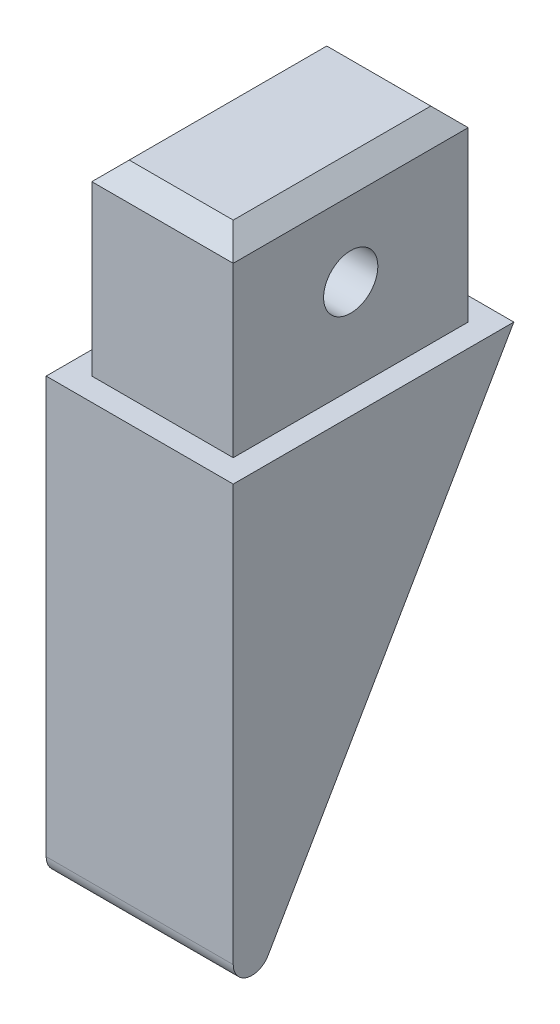
ISO-10303-21;
HEADER;
FILE_DESCRIPTION(('STEP AP214'),'2;1');
FILE_NAME('part.step','',(''),(''),'','','');
FILE_SCHEMA(('AUTOMOTIVE_DESIGN { 1 0 10303 214 1 1 1 1 }'));
ENDSEC;
DATA;
#1=APPLICATION_CONTEXT('core data for automotive mechanical design processes');
#2=APPLICATION_PROTOCOL_DEFINITION('international standard','automotive_design',2000,#1);
#3=PRODUCT_CONTEXT('',#1,'mechanical');
#4=PRODUCT('Part','Part','',(#3));
#5=PRODUCT_RELATED_PRODUCT_CATEGORY('part','',(#4));
#6=PRODUCT_DEFINITION_FORMATION('','',#4);
#7=PRODUCT_DEFINITION_CONTEXT('part definition',#1,'design');
#8=PRODUCT_DEFINITION('design','',#6,#7);
#9=PRODUCT_DEFINITION_SHAPE('','',#8);
#10=(LENGTH_UNIT() NAMED_UNIT(*) SI_UNIT(.MILLI.,.METRE.));
#11=(NAMED_UNIT(*) PLANE_ANGLE_UNIT() SI_UNIT($,.RADIAN.));
#12=(NAMED_UNIT(*) SI_UNIT($,.STERADIAN.) SOLID_ANGLE_UNIT());
#13=UNCERTAINTY_MEASURE_WITH_UNIT(LENGTH_MEASURE(1.E-05),#10,'distance_accuracy_value','');
#14=(GEOMETRIC_REPRESENTATION_CONTEXT(3) GLOBAL_UNCERTAINTY_ASSIGNED_CONTEXT((#13)) GLOBAL_UNIT_ASSIGNED_CONTEXT((#10,
#11,#12)) REPRESENTATION_CONTEXT('',''));
#15=CARTESIAN_POINT('',(0.,0.,0.));
#16=DIRECTION('',(0.,0.,1.));
#17=DIRECTION('',(1.,0.,0.));
#18=AXIS2_PLACEMENT_3D('',#15,#16,#17);
#19=CARTESIAN_POINT('',(-3.78,10.,6.28));
#20=DIRECTION('',(1.,0.,0.));
#21=DIRECTION('',(0.,0.,-1.));
#22=AXIS2_PLACEMENT_3D('',#19,#20,#21);
#23=PLANE('',#22);
#24=CARTESIAN_POINT('',(-3.78,5.,0.));
#25=DIRECTION('',(1.,0.,0.));
#26=DIRECTION('',(0.,0.,-1.));
#27=AXIS2_PLACEMENT_3D('',#24,#25,#26);
#28=CIRCLE('',#27,1.45000000000001);
#29=CARTESIAN_POINT('',(-3.78,5.,-1.45000000000001));
#30=VERTEX_POINT('',#29);
#31=EDGE_CURVE('E153',#30,#30,#28,.T.);
#32=ORIENTED_EDGE('',*,*,#31,.T.);
#33=EDGE_LOOP('',(#32));
#34=FACE_BOUND('',#33,.T.);
#35=DIRECTION('',(0.,-1.,0.));
#36=VECTOR('',#35,1.);
#37=CARTESIAN_POINT('',(-3.78,10.,6.28));
#38=LINE('',#37,#36);
#39=CARTESIAN_POINT('',(-3.78,9.,6.28));
#40=VERTEX_POINT('',#39);
#41=CARTESIAN_POINT('',(-3.78,0.,6.28));
#42=VERTEX_POINT('',#41);
#43=EDGE_CURVE('E193',#40,#42,#38,.T.);
#44=ORIENTED_EDGE('',*,*,#43,.F.);
#45=DIRECTION('',(0.,0.,-1.));
#46=VECTOR('',#45,1.);
#47=CARTESIAN_POINT('',(-3.78,9.,6.28));
#48=LINE('',#47,#46);
#49=CARTESIAN_POINT('',(-3.78,9.,-6.28));
#50=VERTEX_POINT('',#49);
#51=EDGE_CURVE('E220',#40,#50,#48,.T.);
#52=ORIENTED_EDGE('',*,*,#51,.T.);
#53=DIRECTION('',(0.,-1.,0.));
#54=VECTOR('',#53,1.);
#55=CARTESIAN_POINT('',(-3.78,10.,-6.28));
#56=LINE('',#55,#54);
#57=CARTESIAN_POINT('',(-3.78,0.,-6.28));
#58=VERTEX_POINT('',#57);
#59=EDGE_CURVE('E181',#50,#58,#56,.T.);
#60=ORIENTED_EDGE('',*,*,#59,.T.);
#61=DIRECTION('',(0.,0.,1.));
#62=VECTOR('',#61,1.);
#63=CARTESIAN_POINT('',(-3.78,0.,6.28));
#64=LINE('',#63,#62);
#65=EDGE_CURVE('E164',#58,#42,#64,.T.);
#66=ORIENTED_EDGE('',*,*,#65,.T.);
#67=EDGE_LOOP('',(#44,#52,#60,#66));
#68=FACE_BOUND('',#67,.T.);
#69=ADVANCED_FACE('F47',(#34,#68),#23,.F.);
#70=CARTESIAN_POINT('',(-3.78,10.,6.28));
#71=DIRECTION('',(0.,0.,-1.));
#72=DIRECTION('',(-1.,0.,0.));
#73=AXIS2_PLACEMENT_3D('',#70,#71,#72);
#74=PLANE('',#73);
#75=DIRECTION('',(0.,-1.,0.));
#76=VECTOR('',#75,1.);
#77=CARTESIAN_POINT('',(3.78,10.,6.28));
#78=LINE('',#77,#76);
#79=CARTESIAN_POINT('',(3.78,9.,6.28));
#80=VERTEX_POINT('',#79);
#81=CARTESIAN_POINT('',(3.78,0.,6.28));
#82=VERTEX_POINT('',#81);
#83=EDGE_CURVE('E189',#80,#82,#78,.T.);
#84=ORIENTED_EDGE('',*,*,#83,.F.);
#85=DIRECTION('',(-1.,0.,0.));
#86=VECTOR('',#85,1.);
#87=CARTESIAN_POINT('',(-3.78,9.,6.28));
#88=LINE('',#87,#86);
#89=EDGE_CURVE('E217',#80,#40,#88,.T.);
#90=ORIENTED_EDGE('',*,*,#89,.T.);
#91=ORIENTED_EDGE('',*,*,#43,.T.);
#92=DIRECTION('',(1.,0.,0.));
#93=VECTOR('',#92,1.);
#94=CARTESIAN_POINT('',(-3.78,0.,6.28));
#95=LINE('',#94,#93);
#96=EDGE_CURVE('E168',#42,#82,#95,.T.);
#97=ORIENTED_EDGE('',*,*,#96,.T.);
#98=EDGE_LOOP('',(#84,#90,#91,#97));
#99=FACE_BOUND('',#98,.T.);
#100=ADVANCED_FACE('F256',(#99),#74,.F.);
#101=CARTESIAN_POINT('',(3.78,10.,6.28));
#102=DIRECTION('',(-1.,0.,0.));
#103=DIRECTION('',(0.,0.,1.));
#104=AXIS2_PLACEMENT_3D('',#101,#102,#103);
#105=PLANE('',#104);
#106=CARTESIAN_POINT('',(3.78,5.,0.));
#107=DIRECTION('',(1.,0.,0.));
#108=DIRECTION('',(0.,0.,-1.));
#109=AXIS2_PLACEMENT_3D('',#106,#107,#108);
#110=CIRCLE('',#109,1.45000000000001);
#111=CARTESIAN_POINT('',(3.78,5.,-1.45000000000001));
#112=VERTEX_POINT('',#111);
#113=EDGE_CURVE('E335',#112,#112,#110,.T.);
#114=ORIENTED_EDGE('',*,*,#113,.F.);
#115=EDGE_LOOP('',(#114));
#116=FACE_BOUND('',#115,.T.);
#117=DIRECTION('',(0.,-1.,0.));
#118=VECTOR('',#117,1.);
#119=CARTESIAN_POINT('',(3.78,10.,-6.28));
#120=LINE('',#119,#118);
#121=CARTESIAN_POINT('',(3.78,9.,-6.28));
#122=VERTEX_POINT('',#121);
#123=CARTESIAN_POINT('',(3.78,0.,-6.28));
#124=VERTEX_POINT('',#123);
#125=EDGE_CURVE('E185',#122,#124,#120,.T.);
#126=ORIENTED_EDGE('',*,*,#125,.F.);
#127=DIRECTION('',(0.,0.,1.));
#128=VECTOR('',#127,1.);
#129=CARTESIAN_POINT('',(3.78,9.,6.28));
#130=LINE('',#129,#128);
#131=EDGE_CURVE('E214',#122,#80,#130,.T.);
#132=ORIENTED_EDGE('',*,*,#131,.T.);
#133=ORIENTED_EDGE('',*,*,#83,.T.);
#134=DIRECTION('',(0.,0.,-1.));
#135=VECTOR('',#134,1.);
#136=CARTESIAN_POINT('',(3.78,0.,6.28));
#137=LINE('',#136,#135);
#138=EDGE_CURVE('E173',#82,#124,#137,.T.);
#139=ORIENTED_EDGE('',*,*,#138,.T.);
#140=EDGE_LOOP('',(#126,#132,#133,#139));
#141=FACE_BOUND('',#140,.T.);
#142=ADVANCED_FACE('F264',(#116,#141),#105,.F.);
#143=CARTESIAN_POINT('',(-3.78,10.,-6.28));
#144=DIRECTION('',(0.,0.,1.));
#145=DIRECTION('',(1.,0.,0.));
#146=AXIS2_PLACEMENT_3D('',#143,#144,#145);
#147=PLANE('',#146);
#148=ORIENTED_EDGE('',*,*,#59,.F.);
#149=DIRECTION('',(1.,0.,0.));
#150=VECTOR('',#149,1.);
#151=CARTESIAN_POINT('',(-3.78,9.,-6.28));
#152=LINE('',#151,#150);
#153=EDGE_CURVE('E210',#50,#122,#152,.T.);
#154=ORIENTED_EDGE('',*,*,#153,.T.);
#155=ORIENTED_EDGE('',*,*,#125,.T.);
#156=DIRECTION('',(-1.,0.,0.));
#157=VECTOR('',#156,1.);
#158=CARTESIAN_POINT('',(-3.78,0.,-6.28));
#159=LINE('',#158,#157);
#160=EDGE_CURVE('E177',#124,#58,#159,.T.);
#161=ORIENTED_EDGE('',*,*,#160,.T.);
#162=EDGE_LOOP('',(#148,#154,#155,#161));
#163=FACE_BOUND('',#162,.T.);
#164=ADVANCED_FACE('F301',(#163),#147,.F.);
#165=CARTESIAN_POINT('',(0.,10.,0.));
#166=DIRECTION('',(0.,-1.,0.));
#167=DIRECTION('',(0.,0.,-1.));
#168=AXIS2_PLACEMENT_3D('',#165,#166,#167);
#169=PLANE('',#168);
#170=DIRECTION('',(0.,0.,-1.));
#171=VECTOR('',#170,1.);
#172=CARTESIAN_POINT('',(2.78,10.,0.));
#173=LINE('',#172,#171);
#174=CARTESIAN_POINT('',(2.78,10.,5.28));
#175=VERTEX_POINT('',#174);
#176=CARTESIAN_POINT('',(2.78,10.,-5.28));
#177=VERTEX_POINT('',#176);
#178=EDGE_CURVE('E203',#175,#177,#173,.T.);
#179=ORIENTED_EDGE('',*,*,#178,.T.);
#180=DIRECTION('',(-1.,0.,0.));
#181=VECTOR('',#180,1.);
#182=CARTESIAN_POINT('',(0.,10.,-5.28));
#183=LINE('',#182,#181);
#184=CARTESIAN_POINT('',(-2.78,10.,-5.28));
#185=VERTEX_POINT('',#184);
#186=EDGE_CURVE('E206',#177,#185,#183,.T.);
#187=ORIENTED_EDGE('',*,*,#186,.T.);
#188=DIRECTION('',(0.,0.,1.));
#189=VECTOR('',#188,1.);
#190=CARTESIAN_POINT('',(-2.78,10.,0.));
#191=LINE('',#190,#189);
#192=CARTESIAN_POINT('',(-2.78,10.,5.28));
#193=VERTEX_POINT('',#192);
#194=EDGE_CURVE('E197',#185,#193,#191,.T.);
#195=ORIENTED_EDGE('',*,*,#194,.T.);
#196=DIRECTION('',(1.,0.,0.));
#197=VECTOR('',#196,1.);
#198=CARTESIAN_POINT('',(0.,10.,5.28));
#199=LINE('',#198,#197);
#200=EDGE_CURVE('E200',#193,#175,#199,.T.);
#201=ORIENTED_EDGE('',*,*,#200,.T.);
#202=EDGE_LOOP('',(#179,#187,#195,#201));
#203=FACE_BOUND('',#202,.T.);
#204=ADVANCED_FACE('F296',(#203),#169,.F.);
#205=CARTESIAN_POINT('',(0.,10.,5.28));
#206=DIRECTION('',(0.,-0.707106781186546,-0.707106781186549));
#207=DIRECTION('',(1.,0.,0.));
#208=AXIS2_PLACEMENT_3D('',#205,#206,#207);
#209=PLANE('',#208);
#210=DIRECTION('',(0.577350269189625,0.577350269189627,-0.577350269189625));
#211=VECTOR('',#210,1.);
#212=CARTESIAN_POINT('',(-1.02000000000001,11.76,3.52000000000001));
#213=LINE('',#212,#211);
#214=EDGE_CURVE('E229',#40,#193,#213,.T.);
#215=ORIENTED_EDGE('',*,*,#214,.F.);
#216=ORIENTED_EDGE('',*,*,#89,.F.);
#217=DIRECTION('',(-0.577350269189625,0.577350269189627,-0.577350269189625));
#218=VECTOR('',#217,1.);
#219=CARTESIAN_POINT('',(1.85333333333334,10.9266666666667,4.35333333333334));
#220=LINE('',#219,#218);
#221=EDGE_CURVE('E169',#175,#80,#220,.F.);
#222=ORIENTED_EDGE('',*,*,#221,.F.);
#223=ORIENTED_EDGE('',*,*,#200,.F.);
#224=EDGE_LOOP('',(#215,#216,#222,#223));
#225=FACE_BOUND('',#224,.T.);
#226=ADVANCED_FACE('F291',(#225),#209,.F.);
#227=CARTESIAN_POINT('',(2.78,10.,0.));
#228=DIRECTION('',(-0.707106781186549,-0.707106781186546,0.));
#229=DIRECTION('',(0.,0.,-1.));
#230=AXIS2_PLACEMENT_3D('',#227,#228,#229);
#231=PLANE('',#230);
#232=ORIENTED_EDGE('',*,*,#221,.T.);
#233=ORIENTED_EDGE('',*,*,#131,.F.);
#234=DIRECTION('',(-0.577350269189625,0.577350269189627,0.577350269189625));
#235=VECTOR('',#234,1.);
#236=CARTESIAN_POINT('',(1.02000000000001,11.76,-3.52));
#237=LINE('',#236,#235);
#238=EDGE_CURVE('E226',#177,#122,#237,.F.);
#239=ORIENTED_EDGE('',*,*,#238,.F.);
#240=ORIENTED_EDGE('',*,*,#178,.F.);
#241=EDGE_LOOP('',(#232,#233,#239,#240));
#242=FACE_BOUND('',#241,.T.);
#243=ADVANCED_FACE('F285',(#242),#231,.F.);
#244=CARTESIAN_POINT('',(-2.78,10.,0.));
#245=DIRECTION('',(0.707106781186549,-0.707106781186546,0.));
#246=DIRECTION('',(0.,0.,1.));
#247=AXIS2_PLACEMENT_3D('',#244,#245,#246);
#248=PLANE('',#247);
#249=ORIENTED_EDGE('',*,*,#214,.T.);
#250=ORIENTED_EDGE('',*,*,#194,.F.);
#251=DIRECTION('',(-0.577350269189625,-0.577350269189627,-0.577350269189625));
#252=VECTOR('',#251,1.);
#253=CARTESIAN_POINT('',(-1.02000000000001,11.76,-3.52));
#254=LINE('',#253,#252);
#255=EDGE_CURVE('E141',#50,#185,#254,.F.);
#256=ORIENTED_EDGE('',*,*,#255,.F.);
#257=ORIENTED_EDGE('',*,*,#51,.F.);
#258=EDGE_LOOP('',(#249,#250,#256,#257));
#259=FACE_BOUND('',#258,.T.);
#260=ADVANCED_FACE('F278',(#259),#248,.F.);
#261=CARTESIAN_POINT('',(0.,10.,-5.28));
#262=DIRECTION('',(0.,-0.707106781186546,0.707106781186549));
#263=DIRECTION('',(-1.,0.,0.));
#264=AXIS2_PLACEMENT_3D('',#261,#262,#263);
#265=PLANE('',#264);
#266=ORIENTED_EDGE('',*,*,#238,.T.);
#267=ORIENTED_EDGE('',*,*,#153,.F.);
#268=ORIENTED_EDGE('',*,*,#255,.T.);
#269=ORIENTED_EDGE('',*,*,#186,.F.);
#270=EDGE_LOOP('',(#266,#267,#268,#269));
#271=FACE_BOUND('',#270,.T.);
#272=ADVANCED_FACE('F272',(#271),#265,.F.);
#273=CARTESIAN_POINT('',(5.,0.,0.));
#274=DIRECTION('',(0.,1.,0.));
#275=DIRECTION('',(0.,0.,1.));
#276=AXIS2_PLACEMENT_3D('',#273,#274,#275);
#277=PLANE('',#276);
#278=DIRECTION('',(0.,0.,-1.));
#279=VECTOR('',#278,1.);
#280=CARTESIAN_POINT('',(-5.,0.,0.));
#281=LINE('',#280,#279);
#282=CARTESIAN_POINT('',(-5.,0.,7.5));
#283=VERTEX_POINT('',#282);
#284=CARTESIAN_POINT('',(-5.,0.,-7.5));
#285=VERTEX_POINT('',#284);
#286=EDGE_CURVE('E139',#283,#285,#281,.T.);
#287=ORIENTED_EDGE('',*,*,#286,.F.);
#288=DIRECTION('',(-1.,0.,0.));
#289=VECTOR('',#288,1.);
#290=CARTESIAN_POINT('',(5.,0.,7.5));
#291=LINE('',#290,#289);
#292=CARTESIAN_POINT('',(5.,0.,7.5));
#293=VERTEX_POINT('',#292);
#294=EDGE_CURVE('E124',#293,#283,#291,.T.);
#295=ORIENTED_EDGE('',*,*,#294,.F.);
#296=DIRECTION('',(0.,0.,-1.));
#297=VECTOR('',#296,1.);
#298=CARTESIAN_POINT('',(5.,0.,0.));
#299=LINE('',#298,#297);
#300=CARTESIAN_POINT('',(5.,0.,-7.5));
#301=VERTEX_POINT('',#300);
#302=EDGE_CURVE('E131',#293,#301,#299,.T.);
#303=ORIENTED_EDGE('',*,*,#302,.T.);
#304=DIRECTION('',(-1.,0.,0.));
#305=VECTOR('',#304,1.);
#306=CARTESIAN_POINT('',(5.,0.,-7.5));
#307=LINE('',#306,#305);
#308=EDGE_CURVE('E142',#301,#285,#307,.T.);
#309=ORIENTED_EDGE('',*,*,#308,.T.);
#310=EDGE_LOOP('',(#287,#295,#303,#309));
#311=FACE_BOUND('',#310,.T.);
#312=ORIENTED_EDGE('',*,*,#65,.F.);
#313=ORIENTED_EDGE('',*,*,#160,.F.);
#314=ORIENTED_EDGE('',*,*,#138,.F.);
#315=ORIENTED_EDGE('',*,*,#96,.F.);
#316=EDGE_LOOP('',(#312,#313,#314,#315));
#317=FACE_BOUND('',#316,.T.);
#318=ADVANCED_FACE('F135',(#311,#317),#277,.T.);
#319=CARTESIAN_POINT('',(5.,0.,7.5));
#320=DIRECTION('',(0.,0.,1.));
#321=DIRECTION('',(1.,0.,0.));
#322=AXIS2_PLACEMENT_3D('',#319,#320,#321);
#323=PLANE('',#322);
#324=DIRECTION('',(0.,1.,0.));
#325=VECTOR('',#324,1.);
#326=CARTESIAN_POINT('',(-5.,0.,7.5));
#327=LINE('',#326,#325);
#328=CARTESIAN_POINT('',(-5.,-22.248711305964,7.5));
#329=VERTEX_POINT('',#328);
#330=EDGE_CURVE('E150',#329,#283,#327,.T.);
#331=ORIENTED_EDGE('',*,*,#330,.F.);
#332=DIRECTION('',(-1.,0.,0.));
#333=VECTOR('',#332,1.);
#334=CARTESIAN_POINT('',(5.,-22.248711305964,7.5));
#335=LINE('',#334,#333);
#336=CARTESIAN_POINT('',(5.,-22.248711305964,7.5));
#337=VERTEX_POINT('',#336);
#338=EDGE_CURVE('E56',#329,#337,#335,.F.);
#339=ORIENTED_EDGE('',*,*,#338,.T.);
#340=DIRECTION('',(0.,1.,0.));
#341=VECTOR('',#340,1.);
#342=CARTESIAN_POINT('',(5.,0.,7.5));
#343=LINE('',#342,#341);
#344=EDGE_CURVE('E121',#337,#293,#343,.T.);
#345=ORIENTED_EDGE('',*,*,#344,.T.);
#346=ORIENTED_EDGE('',*,*,#294,.T.);
#347=EDGE_LOOP('',(#331,#339,#345,#346));
#348=FACE_BOUND('',#347,.T.);
#349=ADVANCED_FACE('F123',(#348),#323,.T.);
#350=CARTESIAN_POINT('',(5.,-3.24759526419166,-5.62499999999997));
#351=DIRECTION('',(0.,-0.500000000000004,-0.866025403784436));
#352=DIRECTION('',(0.,0.866025403784436,-0.500000000000004));
#353=AXIS2_PLACEMENT_3D('',#350,#351,#352);
#354=PLANE('',#353);
#355=DIRECTION('',(0.,-0.866025403784436,0.500000000000004));
#356=VECTOR('',#355,1.);
#357=CARTESIAN_POINT('',(5.,-3.24759526419166,-5.62499999999997));
#358=LINE('',#357,#356);
#359=CARTESIAN_POINT('',(5.,-22.748711305964,5.63397459621556));
#360=VERTEX_POINT('',#359);
#361=EDGE_CURVE('E130',#301,#360,#358,.T.);
#362=ORIENTED_EDGE('',*,*,#361,.T.);
#363=DIRECTION('',(-1.,0.,0.));
#364=VECTOR('',#363,1.);
#365=CARTESIAN_POINT('',(5.,-22.748711305964,5.63397459621556));
#366=LINE('',#365,#364);
#367=CARTESIAN_POINT('',(-5.,-22.748711305964,5.63397459621556));
#368=VERTEX_POINT('',#367);
#369=EDGE_CURVE('E223',#360,#368,#366,.T.);
#370=ORIENTED_EDGE('',*,*,#369,.T.);
#371=DIRECTION('',(0.,-0.866025403784436,0.500000000000004));
#372=VECTOR('',#371,1.);
#373=CARTESIAN_POINT('',(-5.,-3.24759526419166,-5.62499999999997));
#374=LINE('',#373,#372);
#375=EDGE_CURVE('E147',#285,#368,#374,.T.);
#376=ORIENTED_EDGE('',*,*,#375,.F.);
#377=ORIENTED_EDGE('',*,*,#308,.F.);
#378=EDGE_LOOP('',(#362,#370,#376,#377));
#379=FACE_BOUND('',#378,.T.);
#380=ADVANCED_FACE('F244',(#379),#354,.T.);
#381=CARTESIAN_POINT('',(5.,0.,0.));
#382=DIRECTION('',(1.,0.,0.));
#383=DIRECTION('',(0.,0.,-1.));
#384=AXIS2_PLACEMENT_3D('',#381,#382,#383);
#385=PLANE('',#384);
#386=ORIENTED_EDGE('',*,*,#344,.F.);
#387=CARTESIAN_POINT('',(5.,-22.248711305964,6.5));
#388=DIRECTION('',(1.,0.,0.));
#389=DIRECTION('',(0.,0.,-1.));
#390=AXIS2_PLACEMENT_3D('',#387,#388,#389);
#391=CIRCLE('',#390,1.);
#392=EDGE_CURVE('E11',#337,#360,#391,.T.);
#393=ORIENTED_EDGE('',*,*,#392,.T.);
#394=ORIENTED_EDGE('',*,*,#361,.F.);
#395=ORIENTED_EDGE('',*,*,#302,.F.);
#396=EDGE_LOOP('',(#386,#393,#394,#395));
#397=FACE_BOUND('',#396,.T.);
#398=ADVANCED_FACE('F144',(#397),#385,.T.);
#399=CARTESIAN_POINT('',(-5.,0.,0.));
#400=DIRECTION('',(1.,0.,0.));
#401=DIRECTION('',(0.,0.,-1.));
#402=AXIS2_PLACEMENT_3D('',#399,#400,#401);
#403=PLANE('',#402);
#404=ORIENTED_EDGE('',*,*,#375,.T.);
#405=CARTESIAN_POINT('',(-5.,-22.248711305964,6.5));
#406=DIRECTION('',(1.,0.,0.));
#407=DIRECTION('',(0.,0.,-1.));
#408=AXIS2_PLACEMENT_3D('',#405,#406,#407);
#409=CIRCLE('',#408,1.);
#410=EDGE_CURVE('E70',#368,#329,#409,.F.);
#411=ORIENTED_EDGE('',*,*,#410,.T.);
#412=ORIENTED_EDGE('',*,*,#330,.T.);
#413=ORIENTED_EDGE('',*,*,#286,.T.);
#414=EDGE_LOOP('',(#404,#411,#412,#413));
#415=FACE_BOUND('',#414,.T.);
#416=ADVANCED_FACE('F246',(#415),#403,.F.);
#417=CARTESIAN_POINT('',(-6.22,5.,0.));
#418=DIRECTION('',(1.,0.,0.));
#419=DIRECTION('',(0.,0.,-1.));
#420=AXIS2_PLACEMENT_3D('',#417,#418,#419);
#421=CYLINDRICAL_SURFACE('',#420,1.45000000000001);
#422=ORIENTED_EDGE('',*,*,#113,.T.);
#423=EDGE_LOOP('',(#422));
#424=FACE_BOUND('',#423,.T.);
#425=ORIENTED_EDGE('',*,*,#31,.F.);
#426=EDGE_LOOP('',(#425));
#427=FACE_BOUND('',#426,.T.);
#428=ADVANCED_FACE('F248',(#424,#427),#421,.F.);
#429=CARTESIAN_POINT('',(5.,-22.248711305964,6.5));
#430=DIRECTION('',(-1.,0.,0.));
#431=DIRECTION('',(0.,0.,1.));
#432=AXIS2_PLACEMENT_3D('',#429,#430,#431);
#433=CYLINDRICAL_SURFACE('',#432,1.);
#434=ORIENTED_EDGE('',*,*,#392,.F.);
#435=ORIENTED_EDGE('',*,*,#338,.F.);
#436=ORIENTED_EDGE('',*,*,#410,.F.);
#437=ORIENTED_EDGE('',*,*,#369,.F.);
#438=EDGE_LOOP('',(#434,#435,#436,#437));
#439=FACE_BOUND('',#438,.T.);
#440=ADVANCED_FACE('F49',(#439),#433,.T.);
#441=CLOSED_SHELL('',(#69,#100,#142,#164,#204,#226,#243,#260,#272,#318,#349,#380,#398,#416,#428,#440));
#442=MANIFOLD_SOLID_BREP('B2',#441);
#443=ADVANCED_BREP_SHAPE_REPRESENTATION('',(#18,#442),#14);
#444=SHAPE_DEFINITION_REPRESENTATION(#9,#443);
ENDSEC;
END-ISO-10303-21;
